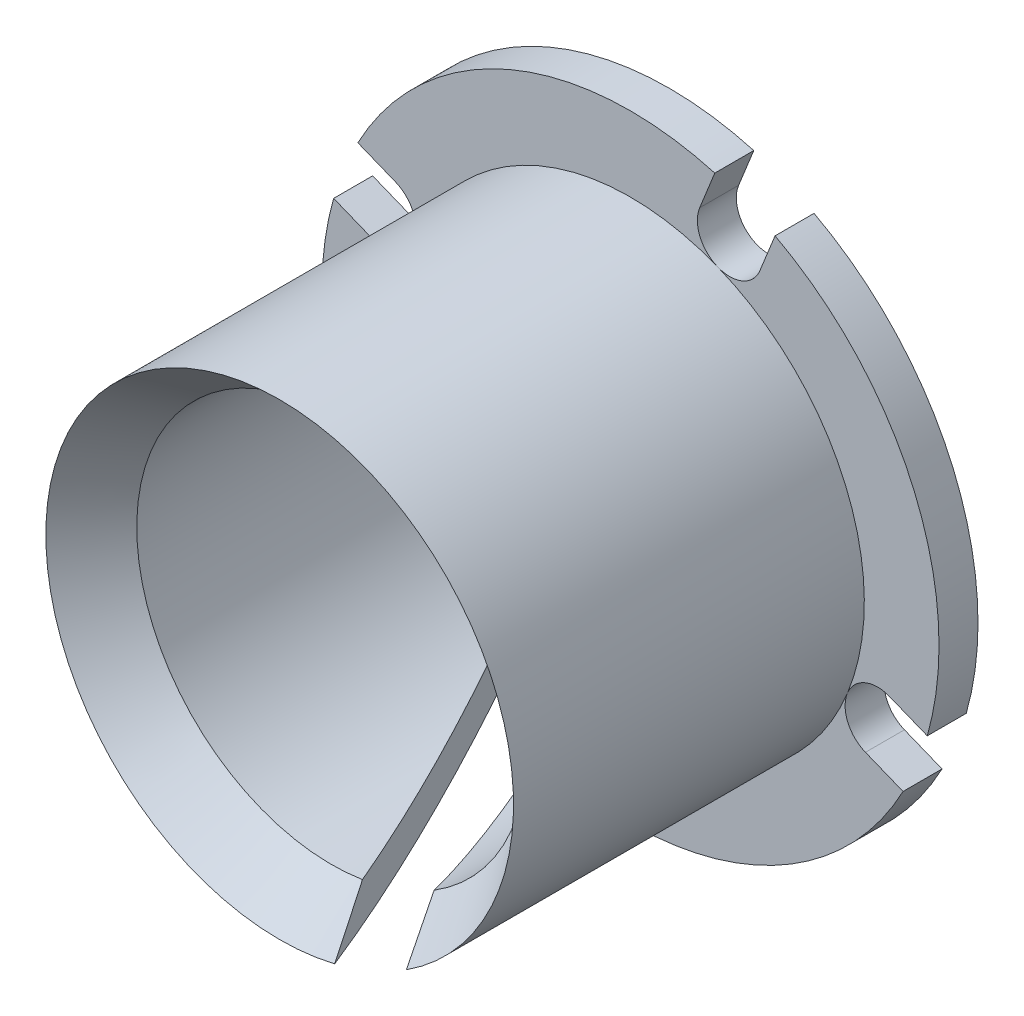
ISO-10303-21;
HEADER;
FILE_DESCRIPTION(('STEP AP214'),'2;1');
FILE_NAME('part.step','',(''),(''),'','','');
FILE_SCHEMA(('AUTOMOTIVE_DESIGN { 1 0 10303 214 1 1 1 1 }'));
ENDSEC;
DATA;
#1=APPLICATION_CONTEXT('core data for automotive mechanical design processes');
#2=APPLICATION_PROTOCOL_DEFINITION('international standard','automotive_design',2000,#1);
#3=PRODUCT_CONTEXT('',#1,'mechanical');
#4=PRODUCT('Part','Part','',(#3));
#5=PRODUCT_RELATED_PRODUCT_CATEGORY('part','',(#4));
#6=PRODUCT_DEFINITION_FORMATION('','',#4);
#7=PRODUCT_DEFINITION_CONTEXT('part definition',#1,'design');
#8=PRODUCT_DEFINITION('design','',#6,#7);
#9=PRODUCT_DEFINITION_SHAPE('','',#8);
#10=(LENGTH_UNIT() NAMED_UNIT(*) SI_UNIT(.MILLI.,.METRE.));
#11=(NAMED_UNIT(*) PLANE_ANGLE_UNIT() SI_UNIT($,.RADIAN.));
#12=(NAMED_UNIT(*) SI_UNIT($,.STERADIAN.) SOLID_ANGLE_UNIT());
#13=UNCERTAINTY_MEASURE_WITH_UNIT(LENGTH_MEASURE(1.E-05),#10,'distance_accuracy_value','');
#14=(GEOMETRIC_REPRESENTATION_CONTEXT(3) GLOBAL_UNCERTAINTY_ASSIGNED_CONTEXT((#13)) GLOBAL_UNIT_ASSIGNED_CONTEXT((#10,
#11,#12)) REPRESENTATION_CONTEXT('',''));
#15=CARTESIAN_POINT('',(0.,0.,0.));
#16=DIRECTION('',(0.,0.,1.));
#17=DIRECTION('',(1.,0.,0.));
#18=AXIS2_PLACEMENT_3D('',#15,#16,#17);
#19=CARTESIAN_POINT('',(-1.57623508961264,-2.09907311503764,0.6));
#20=DIRECTION('',(0.,0.,1.));
#21=DIRECTION('',(1.,0.,0.));
#22=AXIS2_PLACEMENT_3D('',#19,#20,#21);
#23=PLANE('',#22);
#24=CARTESIAN_POINT('',(3.89094409903451E-11,7.33475780112514E-11,0.6));
#25=DIRECTION('',(0.,0.,-1.));
#26=DIRECTION('',(1.,0.,0.));
#27=AXIS2_PLACEMENT_3D('',#24,#25,#26);
#28=CIRCLE('',#27,3.);
#29=CARTESIAN_POINT('',(-0.360597797025849,-2.97824935639324,0.600000000000001));
#30=VERTEX_POINT('',#29);
#31=CARTESIAN_POINT('',(-0.567449420090751,-2.94584472702065,0.6));
#32=VERTEX_POINT('',#31);
#33=EDGE_CURVE('E213',#30,#32,#28,.T.);
#34=ORIENTED_EDGE('',*,*,#33,.F.);
#35=DIRECTION('',(0.120199265684636,0.992749785458992,0.));
#36=VECTOR('',#35,1.);
#37=CARTESIAN_POINT('',(-0.360597797014999,-2.97824935630363,0.6));
#38=LINE('',#37,#36);
#39=CARTESIAN_POINT('',(-0.432717356435095,-3.57389922765595,0.6));
#40=VERTEX_POINT('',#39);
#41=EDGE_CURVE('E334',#40,#30,#38,.T.);
#42=ORIENTED_EDGE('',*,*,#41,.F.);
#43=CARTESIAN_POINT('',(0.,0.,0.6));
#44=DIRECTION('',(0.,0.,1.));
#45=DIRECTION('',(1.,0.,0.));
#46=AXIS2_PLACEMENT_3D('',#43,#44,#45);
#47=CIRCLE('',#46,3.6);
#48=CARTESIAN_POINT('',(-0.56744942009075,-3.5549966463611,0.6));
#49=VERTEX_POINT('',#48);
#50=EDGE_CURVE('E317',#49,#40,#47,.T.);
#51=ORIENTED_EDGE('',*,*,#50,.F.);
#52=DIRECTION('',(0.,1.,0.));
#53=VECTOR('',#52,1.);
#54=CARTESIAN_POINT('',(-0.567449420090751,-2.09907311503764,0.6));
#55=LINE('',#54,#53);
#56=EDGE_CURVE('E219',#32,#49,#55,.F.);
#57=ORIENTED_EDGE('',*,*,#56,.F.);
#58=EDGE_LOOP('',(#34,#42,#51,#57));
#59=FACE_BOUND('',#58,.T.);
#60=ADVANCED_FACE('F43',(#59),#23,.F.);
#61=CARTESIAN_POINT('',(-1.67082733905325,-2.49165326703956,0.6));
#62=VERTEX_POINT('',#61);
#63=CARTESIAN_POINT('',(-1.80141153100389,-2.39894070290262,0.600000000000001));
#64=VERTEX_POINT('',#63);
#65=EDGE_CURVE('E303',#62,#64,#28,.T.);
#66=ORIENTED_EDGE('',*,*,#65,.F.);
#67=DIRECTION('',(0.,1.,0.));
#68=VECTOR('',#67,1.);
#69=CARTESIAN_POINT('',(-1.67082733905324,-1.8,0.600000000000002));
#70=LINE('',#69,#68);
#71=CARTESIAN_POINT('',(-1.67082733905325,-3.18878284037535,0.600000000000001));
#72=VERTEX_POINT('',#71);
#73=EDGE_CURVE('E335',#72,#62,#70,.T.);
#74=ORIENTED_EDGE('',*,*,#73,.F.);
#75=CARTESIAN_POINT('',(0.,0.,0.6));
#76=DIRECTION('',(0.,0.,1.));
#77=DIRECTION('',(1.,0.,0.));
#78=AXIS2_PLACEMENT_3D('',#75,#76,#77);
#79=CIRCLE('',#78,3.6);
#80=CARTESIAN_POINT('',(-2.16169383719339,-2.87872884347243,0.6));
#81=VERTEX_POINT('',#80);
#82=EDGE_CURVE('E328',#81,#72,#79,.T.);
#83=ORIENTED_EDGE('',*,*,#82,.F.);
#84=DIRECTION('',(-0.600470510328625,-0.799646900966721,0.));
#85=VECTOR('',#84,1.);
#86=CARTESIAN_POINT('',(-2.85223492402206,-3.79832277951858,0.6));
#87=LINE('',#86,#85);
#88=EDGE_CURVE('E418',#64,#81,#87,.T.);
#89=ORIENTED_EDGE('',*,*,#88,.F.);
#90=EDGE_LOOP('',(#66,#74,#83,#89));
#91=FACE_BOUND('',#90,.T.);
#92=ADVANCED_FACE('F257',(#91),#23,.F.);
#93=CARTESIAN_POINT('',(1.58994048949753,-1.8,5.22653759134955));
#94=DIRECTION('',(-0.90630778703665,0.,0.4226182617407));
#95=DIRECTION('',(0.4226182617407,0.,0.90630778703665));
#96=AXIS2_PLACEMENT_3D('',#93,#94,#95);
#97=PLANE('',#96);
#98=CARTESIAN_POINT('',(1.95061193395295,-3.02574174097349,6.00000000000442));
#99=CARTESIAN_POINT('',(1.88841727296887,-2.94682796098228,5.86662311911029));
#100=CARTESIAN_POINT('',(1.8262327655277,-2.86786944188103,5.73326801255755));
#101=CARTESIAN_POINT('',(1.70188405668569,-2.70986292412993,5.46660134589275));
#102=CARTESIAN_POINT('',(1.6397198552852,-2.63081492547859,5.33328978578144));
#103=CARTESIAN_POINT('',(1.57756580742796,-2.55172218771569,5.20000000001224));
#104=B_SPLINE_CURVE_WITH_KNOTS('',3,(#98,#99,#100,#101,#102,#103),.UNSPECIFIED.,.F.,.F.,(4,2,4),
(0.,0.500963577850252,1.00192716412446),.UNSPECIFIED.);
#105=CARTESIAN_POINT('',(1.95061193394789,-3.02574174097901,6.00000000000352));
#106=VERTEX_POINT('',#105);
#107=CARTESIAN_POINT('',(1.57756580743147,-2.55172218771946,5.20000000003543));
#108=VERTEX_POINT('',#107);
#109=EDGE_CURVE('E220',#106,#108,#104,.T.);
#110=ORIENTED_EDGE('',*,*,#109,.T.);
#111=CARTESIAN_POINT('',(0.,0.,1.81689920842375));
#112=DIRECTION('',(-0.90630778703665,0.,0.4226182617407));
#113=DIRECTION('',(0.4226182617407,0.,0.90630778703665));
#114=AXIS2_PLACEMENT_3D('',#111,#112,#113);
#115=ELLIPSE('',#114,7.09860474945749,3.);
#116=EDGE_CURVE('E207',#108,#32,#115,.F.);
#117=ORIENTED_EDGE('',*,*,#116,.T.);
#118=ORIENTED_EDGE('',*,*,#56,.T.);
#119=CARTESIAN_POINT('',(0.,0.,1.81689920842375));
#120=DIRECTION('',(-0.90630778703665,0.,0.4226182617407));
#121=DIRECTION('',(0.4226182617407,0.,0.90630778703665));
#122=AXIS2_PLACEMENT_3D('',#119,#120,#121);
#123=ELLIPSE('',#122,8.51832569934899,3.6);
#124=EDGE_CURVE('E231',#106,#49,#123,.F.);
#125=ORIENTED_EDGE('',*,*,#124,.F.);
#126=EDGE_LOOP('',(#110,#117,#118,#125));
#127=FACE_BOUND('',#126,.T.);
#128=ADVANCED_FACE('F229',(#127),#97,.T.);
#129=CARTESIAN_POINT('',(-1.67082733905324,-1.8,0.600000000000002));
#130=DIRECTION('',(0.906307787036648,0.,-0.422618261740703));
#131=DIRECTION('',(-0.422618261740703,0.,-0.906307787036648));
#132=AXIS2_PLACEMENT_3D('',#129,#130,#131);
#133=PLANE('',#132);
#134=CARTESIAN_POINT('',(0.286488104402035,-2.68285445564685,4.79747651411004));
#135=CARTESIAN_POINT('',(0.336580770959158,-2.75851373808357,4.90490058420857));
#136=CARTESIAN_POINT('',(0.386852484449027,-2.83350406392013,5.01270862169347));
#137=CARTESIAN_POINT('',(0.487690802595173,-2.9823593459669,5.22895709281042));
#138=CARTESIAN_POINT('',(0.538257398703318,-3.05622433457663,5.33739750811095));
#139=CARTESIAN_POINT('',(0.639618829733666,-3.20303663328409,5.55476779842828));
#140=CARTESIAN_POINT('',(0.690413635282711,-3.27598405713609,5.66369761045414));
#141=CARTESIAN_POINT('',(0.792196792564427,-3.42112055694541,5.88197229563609));
#142=CARTESIAN_POINT('',(0.84318514587878,-3.49330962668719,5.99131717218411));
#143=CARTESIAN_POINT('',(0.996378765009405,-3.70891428342146,6.31984194858763));
#144=CARTESIAN_POINT('',(1.09882246185626,-3.85138154461204,6.5395331654383));
#145=CARTESIAN_POINT('',(1.25283282266271,-4.0637135050155,6.8698094500179));
#146=CARTESIAN_POINT('',(1.30423048067448,-4.1342672788337,6.98003208332213));
#147=CARTESIAN_POINT('',(1.40712347717803,-4.27497242264103,7.20068682639595));
#148=CARTESIAN_POINT('',(1.45861881478091,-4.3451237962689,7.3111189342593));
#149=CARTESIAN_POINT('',(1.51015594297764,-4.41510317847184,7.42164066234037));
#150=B_SPLINE_CURVE_WITH_KNOTS('',3,(#134,#135,#136,#137,#138,#139,#140,#141,#142,#143,#144,
#145,#146,#147,#148,#149),.UNSPECIFIED.,.F.,.F.,(4,2,2,2,2,2,2,4),(0.,0.421848882340559,
0.843685596211584,1.26546948732284,1.68725683272235,2.53074947763676,2.9525514520657,
3.37434960628119),.UNSPECIFIED.);
#151=CARTESIAN_POINT('',(0.474187888474272,-2.96228726603295,5.20000000003543));
#152=VERTEX_POINT('',#151);
#153=CARTESIAN_POINT('',(0.847234014984004,-3.49888475429196,6.00000000000352));
#154=VERTEX_POINT('',#153);
#155=EDGE_CURVE('E226',#152,#154,#150,.T.);
#156=ORIENTED_EDGE('',*,*,#155,.T.);
#157=CARTESIAN_POINT('',(0.,0.,4.18310079157622));
#158=DIRECTION('',(0.906307787036648,0.,-0.422618261740703));
#159=DIRECTION('',(0.422618261740703,0.,0.906307787036648));
#160=AXIS2_PLACEMENT_3D('',#157,#158,#159);
#161=ELLIPSE('',#160,8.51832569934892,3.6);
#162=EDGE_CURVE('E314',#72,#154,#161,.F.);
#163=ORIENTED_EDGE('',*,*,#162,.F.);
#164=ORIENTED_EDGE('',*,*,#73,.T.);
#165=CARTESIAN_POINT('',(0.,0.,4.18310079157622));
#166=DIRECTION('',(0.906307787036648,0.,-0.422618261740703));
#167=DIRECTION('',(0.422618261740703,0.,0.906307787036648));
#168=AXIS2_PLACEMENT_3D('',#165,#166,#167);
#169=ELLIPSE('',#168,7.09860474948767,3.00000000001278);
#170=EDGE_CURVE('E271',#62,#152,#169,.F.);
#171=ORIENTED_EDGE('',*,*,#170,.T.);
#172=EDGE_LOOP('',(#156,#163,#164,#171));
#173=FACE_BOUND('',#172,.T.);
#174=ADVANCED_FACE('F256',(#173),#133,.T.);
#175=CARTESIAN_POINT('',(0.,0.,3.3));
#176=DIRECTION('',(0.,0.,1.));
#177=DIRECTION('',(1.,0.,0.));
#178=AXIS2_PLACEMENT_3D('',#175,#176,#177);
#179=CYLINDRICAL_SURFACE('',#178,3.6);
#180=CARTESIAN_POINT('',(-3.80402319216679,1.52948538843122,0.6));
#181=DIRECTION('',(0.,0.,1.));
#182=DIRECTION('',(0.925585700512025,-0.378538123585542,0.));
#183=AXIS2_PLACEMENT_3D('',#180,#181,#182);
#184=CIRCLE('',#183,0.499999999914164);
#185=CARTESIAN_POINT('',(-3.34123034192431,1.34021632664447,0.599999999999998));
#186=VERTEX_POINT('',#185);
#187=CARTESIAN_POINT('',(-3.33901953822351,1.34571487446698,0.599999999999998));
#188=VERTEX_POINT('',#187);
#189=EDGE_CURVE('E304',#186,#188,#184,.T.);
#190=ORIENTED_EDGE('',*,*,#189,.F.);
#191=EDGE_CURVE('E527',#186,#81,#79,.T.);
#192=ORIENTED_EDGE('',*,*,#191,.T.);
#193=ORIENTED_EDGE('',*,*,#82,.T.);
#194=ORIENTED_EDGE('',*,*,#162,.T.);
#195=CARTESIAN_POINT('',(0.,0.,6.));
#196=DIRECTION('',(0.,0.,1.));
#197=DIRECTION('',(1.,0.,0.));
#198=AXIS2_PLACEMENT_3D('',#195,#196,#197);
#199=CIRCLE('',#198,3.6);
#200=EDGE_CURVE('E295',#154,#106,#199,.F.);
#201=ORIENTED_EDGE('',*,*,#200,.T.);
#202=ORIENTED_EDGE('',*,*,#124,.T.);
#203=ORIENTED_EDGE('',*,*,#50,.T.);
#204=CARTESIAN_POINT('',(3.33901953822346,-1.34571487446709,0.599999999999998));
#205=VERTEX_POINT('',#204);
#206=EDGE_CURVE('E321',#40,#205,#47,.T.);
#207=ORIENTED_EDGE('',*,*,#206,.T.);
#208=CARTESIAN_POINT('',(3.80402319224621,-1.52948538828517,0.6));
#209=DIRECTION('',(0.,0.,1.));
#210=DIRECTION('',(-0.92558570063704,0.378538123279861,0.));
#211=AXIS2_PLACEMENT_3D('',#208,#209,#210);
#212=CIRCLE('',#211,0.499999999985834);
#213=CARTESIAN_POINT('',(3.3412303419245,-1.34021632664399,0.599999999999998));
#214=VERTEX_POINT('',#213);
#215=EDGE_CURVE('E320',#214,#205,#212,.T.);
#216=ORIENTED_EDGE('',*,*,#215,.F.);
#217=CARTESIAN_POINT('',(0.,0.,0.6));
#218=DIRECTION('',(0.,0.,1.));
#219=DIRECTION('',(1.,0.,0.));
#220=AXIS2_PLACEMENT_3D('',#217,#218,#219);
#221=CIRCLE('',#220,3.6);
#222=CARTESIAN_POINT('',(1.34571487446698,3.33901953822351,0.599999999999998));
#223=VERTEX_POINT('',#222);
#224=EDGE_CURVE('E311',#214,#223,#221,.T.);
#225=ORIENTED_EDGE('',*,*,#224,.T.);
#226=CARTESIAN_POINT('',(1.52948538836416,3.80402319229973,0.6));
#227=DIRECTION('',(0.,0.,1.));
#228=DIRECTION('',(-0.378538123377475,-0.925585700597119,0.));
#229=AXIS2_PLACEMENT_3D('',#226,#227,#228);
#230=CIRCLE('',#229,0.499999999941252);
#231=CARTESIAN_POINT('',(1.34021632664399,3.3412303419245,0.599999999999998));
#232=VERTEX_POINT('',#231);
#233=EDGE_CURVE('E308',#232,#223,#230,.T.);
#234=ORIENTED_EDGE('',*,*,#233,.F.);
#235=CARTESIAN_POINT('',(0.,0.,0.6));
#236=DIRECTION('',(0.,0.,1.));
#237=DIRECTION('',(1.,0.,0.));
#238=AXIS2_PLACEMENT_3D('',#235,#236,#237);
#239=CIRCLE('',#238,3.6);
#240=EDGE_CURVE('E305',#232,#188,#239,.T.);
#241=ORIENTED_EDGE('',*,*,#240,.T.);
#242=EDGE_LOOP('',(#190,#192,#193,#194,#201,#202,#203,#207,#216,#225,#234,#241));
#243=FACE_BOUND('',#242,.T.);
#244=ADVANCED_FACE('F261',(#243),#179,.T.);
#245=CARTESIAN_POINT('',(3.89094409903451E-11,7.33475780112514E-11,0.6));
#246=DIRECTION('',(0.,0.,1.));
#247=DIRECTION('',(1.,0.,0.));
#248=AXIS2_PLACEMENT_3D('',#245,#246,#247);
#249=PLANE('',#248);
#250=ORIENTED_EDGE('',*,*,#191,.F.);
#251=CARTESIAN_POINT('',(-3.80402319216679,1.52948538843122,0.6));
#252=DIRECTION('',(0.,0.,1.));
#253=DIRECTION('',(-1.,0.,0.));
#254=AXIS2_PLACEMENT_3D('',#251,#252,#253);
#255=CIRCLE('',#254,0.499999999914165);
#256=CARTESIAN_POINT('',(-3.99054625540979,1.06557898969047,0.6));
#257=VERTEX_POINT('',#256);
#258=EDGE_CURVE('E432',#257,#186,#255,.T.);
#259=ORIENTED_EDGE('',*,*,#258,.F.);
#260=DIRECTION('',(0.927812797640781,-0.373046126550037,0.));
#261=VECTOR('',#260,1.);
#262=CARTESIAN_POINT('',(-3.99054625540979,1.06557898969047,0.6));
#263=LINE('',#262,#261);
#264=CARTESIAN_POINT('',(-4.56914971374091,1.29821835345839,0.6));
#265=VERTEX_POINT('',#264);
#266=EDGE_CURVE('E417',#265,#257,#263,.T.);
#267=ORIENTED_EDGE('',*,*,#266,.F.);
#268=CARTESIAN_POINT('',(3.89094409903451E-11,7.33475780112514E-11,0.6));
#269=DIRECTION('',(0.,0.,-1.));
#270=DIRECTION('',(1.,0.,0.));
#271=AXIS2_PLACEMENT_3D('',#268,#269,#270);
#272=CIRCLE('',#271,4.75);
#273=CARTESIAN_POINT('',(-2.85223492402206,-3.79832277951858,0.6));
#274=VERTEX_POINT('',#273);
#275=EDGE_CURVE('E409',#274,#265,#272,.T.);
#276=ORIENTED_EDGE('',*,*,#275,.F.);
#277=EDGE_CURVE('E339',#81,#274,#87,.T.);
#278=ORIENTED_EDGE('',*,*,#277,.F.);
#279=EDGE_LOOP('',(#250,#259,#267,#276,#278));
#280=FACE_BOUND('',#279,.T.);
#281=ADVANCED_FACE('F258',(#280),#249,.T.);
#282=ORIENTED_EDGE('',*,*,#240,.F.);
#283=CARTESIAN_POINT('',(1.52948538836416,3.80402319229973,0.6));
#284=DIRECTION('',(0.,0.,1.));
#285=DIRECTION('',(-1.,0.,0.));
#286=AXIS2_PLACEMENT_3D('',#283,#284,#285);
#287=CIRCLE('',#286,0.499999999941252);
#288=CARTESIAN_POINT('',(1.06557898959304,3.99054625553982,0.6));
#289=VERTEX_POINT('',#288);
#290=EDGE_CURVE('E437',#289,#232,#287,.T.);
#291=ORIENTED_EDGE('',*,*,#290,.F.);
#292=DIRECTION('',(-0.373046126524007,-0.927812797651247,0.));
#293=VECTOR('',#292,1.);
#294=CARTESIAN_POINT('',(1.06557898959304,3.99054625553982,0.6));
#295=LINE('',#294,#293);
#296=CARTESIAN_POINT('',(1.29821835334408,4.56914971387586,0.6));
#297=VERTEX_POINT('',#296);
#298=EDGE_CURVE('E438',#297,#289,#295,.T.);
#299=ORIENTED_EDGE('',*,*,#298,.F.);
#300=CARTESIAN_POINT('',(3.89094409903451E-11,7.33475780112514E-11,0.6));
#301=DIRECTION('',(0.,0.,-1.));
#302=DIRECTION('',(1.,0.,0.));
#303=AXIS2_PLACEMENT_3D('',#300,#301,#302);
#304=CIRCLE('',#303,4.75);
#305=CARTESIAN_POINT('',(-4.19610358726709,2.22603115093304,0.6));
#306=VERTEX_POINT('',#305);
#307=EDGE_CURVE('E666',#306,#297,#304,.T.);
#308=ORIENTED_EDGE('',*,*,#307,.F.);
#309=DIRECTION('',(-0.927812797647302,0.37304612653382,0.));
#310=VECTOR('',#309,1.);
#311=CARTESIAN_POINT('',(-4.19610358726709,2.22603115093304,0.6));
#312=LINE('',#311,#310);
#313=CARTESIAN_POINT('',(-3.6175001289319,1.99339178717523,0.6));
#314=VERTEX_POINT('',#313);
#315=EDGE_CURVE('E427',#314,#306,#312,.T.);
#316=ORIENTED_EDGE('',*,*,#315,.F.);
#317=EDGE_CURVE('E420',#188,#314,#255,.T.);
#318=ORIENTED_EDGE('',*,*,#317,.F.);
#319=EDGE_LOOP('',(#282,#291,#299,#308,#316,#318));
#320=FACE_BOUND('',#319,.T.);
#321=ADVANCED_FACE('F662',(#320),#249,.T.);
#322=ORIENTED_EDGE('',*,*,#224,.F.);
#323=CARTESIAN_POINT('',(3.80402319224621,-1.52948538828517,0.6));
#324=DIRECTION('',(0.,0.,1.));
#325=DIRECTION('',(-1.,0.,0.));
#326=AXIS2_PLACEMENT_3D('',#323,#324,#325);
#327=CIRCLE('',#326,0.499999999985834);
#328=CARTESIAN_POINT('',(3.99054625550783,-1.06557898947466,0.6));
#329=VERTEX_POINT('',#328);
#330=EDGE_CURVE('E341',#329,#214,#327,.T.);
#331=ORIENTED_EDGE('',*,*,#330,.F.);
#332=DIRECTION('',(-0.927812797647302,0.37304612653382,0.));
#333=VECTOR('',#332,1.);
#334=CARTESIAN_POINT('',(3.99054625550783,-1.06557898947466,0.6));
#335=LINE('',#334,#333);
#336=CARTESIAN_POINT('',(4.56914971384143,-1.29821835323182,0.6));
#337=VERTEX_POINT('',#336);
#338=EDGE_CURVE('E351',#337,#329,#335,.T.);
#339=ORIENTED_EDGE('',*,*,#338,.F.);
#340=CARTESIAN_POINT('',(3.89094409903451E-11,7.33475780112514E-11,0.6));
#341=DIRECTION('',(0.,0.,-1.));
#342=DIRECTION('',(1.,0.,0.));
#343=AXIS2_PLACEMENT_3D('',#340,#341,#342);
#344=CIRCLE('',#343,4.75);
#345=CARTESIAN_POINT('',(2.2260311508986,4.19610358737935,0.6));
#346=VERTEX_POINT('',#345);
#347=EDGE_CURVE('E444',#346,#337,#344,.T.);
#348=ORIENTED_EDGE('',*,*,#347,.F.);
#349=DIRECTION('',(0.373046126550038,0.927812797640781,0.));
#350=VECTOR('',#349,1.);
#351=CARTESIAN_POINT('',(2.2260311508986,4.19610358737935,0.6));
#352=LINE('',#351,#350);
#353=CARTESIAN_POINT('',(1.99339178713004,3.61750012904663,0.6));
#354=VERTEX_POINT('',#353);
#355=EDGE_CURVE('E442',#354,#346,#352,.T.);
#356=ORIENTED_EDGE('',*,*,#355,.F.);
#357=EDGE_CURVE('E435',#223,#354,#287,.T.);
#358=ORIENTED_EDGE('',*,*,#357,.F.);
#359=EDGE_LOOP('',(#322,#331,#339,#348,#356,#358));
#360=FACE_BOUND('',#359,.T.);
#361=ADVANCED_FACE('F515',(#360),#249,.T.);
#362=ORIENTED_EDGE('',*,*,#206,.F.);
#363=CARTESIAN_POINT('',(-0.570946511963111,-4.71556148085686,0.6));
#364=VERTEX_POINT('',#363);
#365=EDGE_CURVE('E357',#364,#40,#38,.T.);
#366=ORIENTED_EDGE('',*,*,#365,.F.);
#367=CARTESIAN_POINT('',(3.89094409903451E-11,7.33475780112514E-11,0.6));
#368=DIRECTION('',(0.,0.,-1.));
#369=DIRECTION('',(1.,0.,0.));
#370=AXIS2_PLACEMENT_3D('',#367,#368,#369);
#371=CIRCLE('',#370,4.75);
#372=CARTESIAN_POINT('',(4.196103587306,-2.22603115085969,0.6));
#373=VERTEX_POINT('',#372);
#374=EDGE_CURVE('E355',#373,#364,#371,.T.);
#375=ORIENTED_EDGE('',*,*,#374,.F.);
#376=DIRECTION('',(0.927812797640781,-0.373046126550038,0.));
#377=VECTOR('',#376,1.);
#378=CARTESIAN_POINT('',(4.196103587306,-2.22603115085969,0.6));
#379=LINE('',#378,#377);
#380=CARTESIAN_POINT('',(3.61750012897647,-1.99339178709241,0.6));
#381=VERTEX_POINT('',#380);
#382=EDGE_CURVE('E345',#381,#373,#379,.T.);
#383=ORIENTED_EDGE('',*,*,#382,.F.);
#384=EDGE_CURVE('E346',#205,#381,#327,.T.);
#385=ORIENTED_EDGE('',*,*,#384,.F.);
#386=EDGE_LOOP('',(#362,#366,#375,#383,#385));
#387=FACE_BOUND('',#386,.T.);
#388=ADVANCED_FACE('F467',(#387),#249,.T.);
#389=CARTESIAN_POINT('',(-2.85223492402206,-3.79832277951858,0.));
#390=DIRECTION('',(-0.799646900966721,0.600470510328625,0.));
#391=DIRECTION('',(-0.600470510328625,-0.799646900966721,0.));
#392=AXIS2_PLACEMENT_3D('',#389,#390,#391);
#393=PLANE('',#392);
#394=DIRECTION('',(-0.600470510328625,-0.799646900966721,0.));
#395=VECTOR('',#394,1.);
#396=CARTESIAN_POINT('',(-2.85223492402206,-3.79832277951858,0.));
#397=LINE('',#396,#395);
#398=CARTESIAN_POINT('',(-1.97475243638773,-2.62977887966021,0.));
#399=VERTEX_POINT('',#398);
#400=CARTESIAN_POINT('',(-2.85223492402206,-3.79832277951858,0.));
#401=VERTEX_POINT('',#400);
#402=EDGE_CURVE('E360',#399,#401,#397,.T.);
#403=ORIENTED_EDGE('',*,*,#402,.F.);
#404=DIRECTION('',(0.30023525516127,0.399823450479308,0.866025403787365));
#405=VECTOR('',#404,1.);
#406=CARTESIAN_POINT('',(-1.03395904478566E-11,7.76420085578722E-12,5.69615242278992));
#407=LINE('',#406,#405);
#408=CARTESIAN_POINT('',(-1.80141153094697,-2.39894070282682,0.499999999990934));
#409=VERTEX_POINT('',#408);
#410=EDGE_CURVE('E65',#399,#409,#407,.T.);
#411=ORIENTED_EDGE('',*,*,#410,.T.);
#412=DIRECTION('',(0.,0.,1.));
#413=VECTOR('',#412,1.);
#414=CARTESIAN_POINT('',(-1.80141153094697,-2.39894070282682,0.));
#415=LINE('',#414,#413);
#416=EDGE_CURVE('E233',#409,#64,#415,.T.);
#417=ORIENTED_EDGE('',*,*,#416,.T.);
#418=ORIENTED_EDGE('',*,*,#88,.T.);
#419=ORIENTED_EDGE('',*,*,#277,.T.);
#420=DIRECTION('',(0.,0.,1.));
#421=VECTOR('',#420,1.);
#422=CARTESIAN_POINT('',(-2.85223492402206,-3.79832277951858,0.));
#423=LINE('',#422,#421);
#424=EDGE_CURVE('E238',#401,#274,#423,.T.);
#425=ORIENTED_EDGE('',*,*,#424,.F.);
#426=EDGE_LOOP('',(#403,#411,#417,#418,#419,#425));
#427=FACE_BOUND('',#426,.T.);
#428=ADVANCED_FACE('F279',(#427),#393,.F.);
#429=CARTESIAN_POINT('',(3.89094409903451E-11,7.33475780112514E-11,0.));
#430=DIRECTION('',(0.,0.,1.));
#431=DIRECTION('',(1.,0.,0.));
#432=AXIS2_PLACEMENT_3D('',#429,#430,#431);
#433=CYLINDRICAL_SURFACE('',#432,4.75);
#434=ORIENTED_EDGE('',*,*,#275,.T.);
#435=DIRECTION('',(0.,0.,1.));
#436=VECTOR('',#435,1.);
#437=CARTESIAN_POINT('',(-4.56914971374091,1.29821835345839,0.));
#438=LINE('',#437,#436);
#439=CARTESIAN_POINT('',(-4.56914971374091,1.29821835345839,0.));
#440=VERTEX_POINT('',#439);
#441=EDGE_CURVE('E400',#440,#265,#438,.T.);
#442=ORIENTED_EDGE('',*,*,#441,.F.);
#443=CARTESIAN_POINT('',(3.89094409903451E-11,7.33475780112514E-11,0.));
#444=DIRECTION('',(0.,0.,-1.));
#445=DIRECTION('',(1.,0.,0.));
#446=AXIS2_PLACEMENT_3D('',#443,#444,#445);
#447=CIRCLE('',#446,4.75);
#448=EDGE_CURVE('E410',#401,#440,#447,.T.);
#449=ORIENTED_EDGE('',*,*,#448,.F.);
#450=ORIENTED_EDGE('',*,*,#424,.T.);
#451=EDGE_LOOP('',(#434,#442,#449,#450));
#452=FACE_BOUND('',#451,.T.);
#453=ADVANCED_FACE('F407',(#452),#433,.T.);
#454=CARTESIAN_POINT('',(-3.99054625540979,1.06557898969047,0.));
#455=DIRECTION('',(-0.373046126550037,-0.927812797640781,0.));
#456=DIRECTION('',(0.927812797640781,-0.373046126550037,0.));
#457=AXIS2_PLACEMENT_3D('',#454,#455,#456);
#458=PLANE('',#457);
#459=ORIENTED_EDGE('',*,*,#266,.T.);
#460=DIRECTION('',(0.,0.,1.));
#461=VECTOR('',#460,1.);
#462=CARTESIAN_POINT('',(-3.99054625540979,1.06557898969047,0.));
#463=LINE('',#462,#461);
#464=CARTESIAN_POINT('',(-3.99054625540979,1.06557898969047,0.));
#465=VERTEX_POINT('',#464);
#466=EDGE_CURVE('E397',#465,#257,#463,.T.);
#467=ORIENTED_EDGE('',*,*,#466,.F.);
#468=DIRECTION('',(0.927812797640781,-0.373046126550037,0.));
#469=VECTOR('',#468,1.);
#470=CARTESIAN_POINT('',(-3.99054625540979,1.06557898969047,0.));
#471=LINE('',#470,#469);
#472=EDGE_CURVE('E504',#440,#465,#471,.T.);
#473=ORIENTED_EDGE('',*,*,#472,.F.);
#474=ORIENTED_EDGE('',*,*,#441,.T.);
#475=EDGE_LOOP('',(#459,#467,#473,#474));
#476=FACE_BOUND('',#475,.T.);
#477=ADVANCED_FACE('F514',(#476),#458,.F.);
#478=CARTESIAN_POINT('',(-3.80402319216679,1.52948538843122,0.));
#479=DIRECTION('',(0.,0.,1.));
#480=DIRECTION('',(1.,0.,0.));
#481=AXIS2_PLACEMENT_3D('',#478,#479,#480);
#482=CYLINDRICAL_SURFACE('',#481,0.499999999914165);
#483=ORIENTED_EDGE('',*,*,#258,.T.);
#484=ORIENTED_EDGE('',*,*,#189,.T.);
#485=ORIENTED_EDGE('',*,*,#317,.T.);
#486=DIRECTION('',(0.,0.,1.));
#487=VECTOR('',#486,1.);
#488=CARTESIAN_POINT('',(-3.6175001289319,1.99339178717523,0.));
#489=LINE('',#488,#487);
#490=CARTESIAN_POINT('',(-3.6175001289319,1.99339178717523,0.));
#491=VERTEX_POINT('',#490);
#492=EDGE_CURVE('E394',#491,#314,#489,.T.);
#493=ORIENTED_EDGE('',*,*,#492,.F.);
#494=CARTESIAN_POINT('',(-3.80402319216679,1.52948538843122,0.));
#495=DIRECTION('',(0.,0.,1.));
#496=DIRECTION('',(-1.,0.,0.));
#497=AXIS2_PLACEMENT_3D('',#494,#495,#496);
#498=CIRCLE('',#497,0.499999999914165);
#499=EDGE_CURVE('E502',#465,#491,#498,.T.);
#500=ORIENTED_EDGE('',*,*,#499,.F.);
#501=ORIENTED_EDGE('',*,*,#466,.T.);
#502=EDGE_LOOP('',(#483,#484,#485,#493,#500,#501));
#503=FACE_BOUND('',#502,.T.);
#504=ADVANCED_FACE('F633',(#503),#482,.F.);
#505=CARTESIAN_POINT('',(-4.19610358726709,2.22603115093304,0.));
#506=DIRECTION('',(0.37304612653382,0.927812797647302,0.));
#507=DIRECTION('',(-0.927812797647302,0.37304612653382,0.));
#508=AXIS2_PLACEMENT_3D('',#505,#506,#507);
#509=PLANE('',#508);
#510=ORIENTED_EDGE('',*,*,#315,.T.);
#511=DIRECTION('',(0.,0.,1.));
#512=VECTOR('',#511,1.);
#513=CARTESIAN_POINT('',(-4.19610358726709,2.22603115093304,0.));
#514=LINE('',#513,#512);
#515=CARTESIAN_POINT('',(-4.19610358726709,2.22603115093304,0.));
#516=VERTEX_POINT('',#515);
#517=EDGE_CURVE('E391',#516,#306,#514,.T.);
#518=ORIENTED_EDGE('',*,*,#517,.F.);
#519=DIRECTION('',(-0.927812797647302,0.37304612653382,0.));
#520=VECTOR('',#519,1.);
#521=CARTESIAN_POINT('',(-4.19610358726709,2.22603115093304,0.));
#522=LINE('',#521,#520);
#523=EDGE_CURVE('E500',#491,#516,#522,.T.);
#524=ORIENTED_EDGE('',*,*,#523,.F.);
#525=ORIENTED_EDGE('',*,*,#492,.T.);
#526=EDGE_LOOP('',(#510,#518,#524,#525));
#527=FACE_BOUND('',#526,.T.);
#528=ADVANCED_FACE('F681',(#527),#509,.F.);
#529=CARTESIAN_POINT('',(3.89094409903451E-11,7.33475780112514E-11,0.));
#530=DIRECTION('',(0.,0.,1.));
#531=DIRECTION('',(1.,0.,0.));
#532=AXIS2_PLACEMENT_3D('',#529,#530,#531);
#533=CYLINDRICAL_SURFACE('',#532,4.75);
#534=ORIENTED_EDGE('',*,*,#307,.T.);
#535=DIRECTION('',(0.,0.,1.));
#536=VECTOR('',#535,1.);
#537=CARTESIAN_POINT('',(1.29821835334408,4.56914971387586,0.));
#538=LINE('',#537,#536);
#539=CARTESIAN_POINT('',(1.29821835334408,4.56914971387586,0.));
#540=VERTEX_POINT('',#539);
#541=EDGE_CURVE('E388',#540,#297,#538,.T.);
#542=ORIENTED_EDGE('',*,*,#541,.F.);
#543=CARTESIAN_POINT('',(3.89094409903451E-11,7.33475780112514E-11,0.));
#544=DIRECTION('',(0.,0.,-1.));
#545=DIRECTION('',(1.,0.,0.));
#546=AXIS2_PLACEMENT_3D('',#543,#544,#545);
#547=CIRCLE('',#546,4.75);
#548=EDGE_CURVE('E498',#516,#540,#547,.T.);
#549=ORIENTED_EDGE('',*,*,#548,.F.);
#550=ORIENTED_EDGE('',*,*,#517,.T.);
#551=EDGE_LOOP('',(#534,#542,#549,#550));
#552=FACE_BOUND('',#551,.T.);
#553=ADVANCED_FACE('F679',(#552),#533,.T.);
#554=CARTESIAN_POINT('',(1.06557898959304,3.99054625553982,0.));
#555=DIRECTION('',(-0.927812797651247,0.373046126524007,0.));
#556=DIRECTION('',(-0.373046126524007,-0.927812797651247,0.));
#557=AXIS2_PLACEMENT_3D('',#554,#555,#556);
#558=PLANE('',#557);
#559=ORIENTED_EDGE('',*,*,#298,.T.);
#560=DIRECTION('',(0.,0.,1.));
#561=VECTOR('',#560,1.);
#562=CARTESIAN_POINT('',(1.06557898959304,3.99054625553982,0.));
#563=LINE('',#562,#561);
#564=CARTESIAN_POINT('',(1.06557898959304,3.99054625553982,0.));
#565=VERTEX_POINT('',#564);
#566=EDGE_CURVE('E385',#565,#289,#563,.T.);
#567=ORIENTED_EDGE('',*,*,#566,.F.);
#568=DIRECTION('',(-0.373046126524007,-0.927812797651247,0.));
#569=VECTOR('',#568,1.);
#570=CARTESIAN_POINT('',(1.06557898959304,3.99054625553982,0.));
#571=LINE('',#570,#569);
#572=EDGE_CURVE('E496',#540,#565,#571,.T.);
#573=ORIENTED_EDGE('',*,*,#572,.F.);
#574=ORIENTED_EDGE('',*,*,#541,.T.);
#575=EDGE_LOOP('',(#559,#567,#573,#574));
#576=FACE_BOUND('',#575,.T.);
#577=ADVANCED_FACE('F621',(#576),#558,.F.);
#578=CARTESIAN_POINT('',(1.52948538836416,3.80402319229973,0.));
#579=DIRECTION('',(0.,0.,1.));
#580=DIRECTION('',(1.,0.,0.));
#581=AXIS2_PLACEMENT_3D('',#578,#579,#580);
#582=CYLINDRICAL_SURFACE('',#581,0.499999999941252);
#583=ORIENTED_EDGE('',*,*,#290,.T.);
#584=ORIENTED_EDGE('',*,*,#233,.T.);
#585=ORIENTED_EDGE('',*,*,#357,.T.);
#586=DIRECTION('',(0.,0.,1.));
#587=VECTOR('',#586,1.);
#588=CARTESIAN_POINT('',(1.99339178713004,3.61750012904663,0.));
#589=LINE('',#588,#587);
#590=CARTESIAN_POINT('',(1.99339178713004,3.61750012904663,0.));
#591=VERTEX_POINT('',#590);
#592=EDGE_CURVE('E382',#591,#354,#589,.T.);
#593=ORIENTED_EDGE('',*,*,#592,.F.);
#594=CARTESIAN_POINT('',(1.52948538836416,3.80402319229973,0.));
#595=DIRECTION('',(0.,0.,1.));
#596=DIRECTION('',(-1.,0.,0.));
#597=AXIS2_PLACEMENT_3D('',#594,#595,#596);
#598=CIRCLE('',#597,0.499999999941252);
#599=EDGE_CURVE('E494',#565,#591,#598,.T.);
#600=ORIENTED_EDGE('',*,*,#599,.F.);
#601=ORIENTED_EDGE('',*,*,#566,.T.);
#602=EDGE_LOOP('',(#583,#584,#585,#593,#600,#601));
#603=FACE_BOUND('',#602,.T.);
#604=ADVANCED_FACE('F616',(#603),#582,.F.);
#605=CARTESIAN_POINT('',(2.2260311508986,4.19610358737935,0.));
#606=DIRECTION('',(0.927812797640781,-0.373046126550038,0.));
#607=DIRECTION('',(0.373046126550038,0.927812797640781,0.));
#608=AXIS2_PLACEMENT_3D('',#605,#606,#607);
#609=PLANE('',#608);
#610=ORIENTED_EDGE('',*,*,#355,.T.);
#611=DIRECTION('',(0.,0.,1.));
#612=VECTOR('',#611,1.);
#613=CARTESIAN_POINT('',(2.2260311508986,4.19610358737935,0.));
#614=LINE('',#613,#612);
#615=CARTESIAN_POINT('',(2.2260311508986,4.19610358737935,0.));
#616=VERTEX_POINT('',#615);
#617=EDGE_CURVE('E379',#616,#346,#614,.T.);
#618=ORIENTED_EDGE('',*,*,#617,.F.);
#619=DIRECTION('',(0.373046126550038,0.927812797640781,0.));
#620=VECTOR('',#619,1.);
#621=CARTESIAN_POINT('',(2.2260311508986,4.19610358737935,0.));
#622=LINE('',#621,#620);
#623=EDGE_CURVE('E492',#591,#616,#622,.T.);
#624=ORIENTED_EDGE('',*,*,#623,.F.);
#625=ORIENTED_EDGE('',*,*,#592,.T.);
#626=EDGE_LOOP('',(#610,#618,#624,#625));
#627=FACE_BOUND('',#626,.T.);
#628=ADVANCED_FACE('F613',(#627),#609,.F.);
#629=CARTESIAN_POINT('',(3.89094409903451E-11,7.33475780112514E-11,0.));
#630=DIRECTION('',(0.,0.,1.));
#631=DIRECTION('',(1.,0.,0.));
#632=AXIS2_PLACEMENT_3D('',#629,#630,#631);
#633=CYLINDRICAL_SURFACE('',#632,4.75);
#634=ORIENTED_EDGE('',*,*,#347,.T.);
#635=DIRECTION('',(0.,0.,1.));
#636=VECTOR('',#635,1.);
#637=CARTESIAN_POINT('',(4.56914971384143,-1.29821835323182,0.));
#638=LINE('',#637,#636);
#639=CARTESIAN_POINT('',(4.56914971384143,-1.29821835323182,0.));
#640=VERTEX_POINT('',#639);
#641=EDGE_CURVE('E376',#640,#337,#638,.T.);
#642=ORIENTED_EDGE('',*,*,#641,.F.);
#643=CARTESIAN_POINT('',(3.89094409903451E-11,7.33475780112514E-11,0.));
#644=DIRECTION('',(0.,0.,-1.));
#645=DIRECTION('',(1.,0.,0.));
#646=AXIS2_PLACEMENT_3D('',#643,#644,#645);
#647=CIRCLE('',#646,4.75);
#648=EDGE_CURVE('E490',#616,#640,#647,.T.);
#649=ORIENTED_EDGE('',*,*,#648,.F.);
#650=ORIENTED_EDGE('',*,*,#617,.T.);
#651=EDGE_LOOP('',(#634,#642,#649,#650));
#652=FACE_BOUND('',#651,.T.);
#653=ADVANCED_FACE('F610',(#652),#633,.T.);
#654=CARTESIAN_POINT('',(3.99054625550783,-1.06557898947466,0.));
#655=DIRECTION('',(0.37304612653382,0.927812797647302,0.));
#656=DIRECTION('',(-0.927812797647302,0.37304612653382,0.));
#657=AXIS2_PLACEMENT_3D('',#654,#655,#656);
#658=PLANE('',#657);
#659=ORIENTED_EDGE('',*,*,#338,.T.);
#660=DIRECTION('',(0.,0.,1.));
#661=VECTOR('',#660,1.);
#662=CARTESIAN_POINT('',(3.99054625550783,-1.06557898947466,0.));
#663=LINE('',#662,#661);
#664=CARTESIAN_POINT('',(3.99054625550783,-1.06557898947466,0.));
#665=VERTEX_POINT('',#664);
#666=EDGE_CURVE('E373',#665,#329,#663,.T.);
#667=ORIENTED_EDGE('',*,*,#666,.F.);
#668=DIRECTION('',(-0.927812797647302,0.37304612653382,0.));
#669=VECTOR('',#668,1.);
#670=CARTESIAN_POINT('',(3.99054625550783,-1.06557898947466,0.));
#671=LINE('',#670,#669);
#672=EDGE_CURVE('E488',#640,#665,#671,.T.);
#673=ORIENTED_EDGE('',*,*,#672,.F.);
#674=ORIENTED_EDGE('',*,*,#641,.T.);
#675=EDGE_LOOP('',(#659,#667,#673,#674));
#676=FACE_BOUND('',#675,.T.);
#677=ADVANCED_FACE('F606',(#676),#658,.F.);
#678=CARTESIAN_POINT('',(3.80402319224621,-1.52948538828517,0.));
#679=DIRECTION('',(0.,0.,1.));
#680=DIRECTION('',(1.,0.,0.));
#681=AXIS2_PLACEMENT_3D('',#678,#679,#680);
#682=CYLINDRICAL_SURFACE('',#681,0.499999999985834);
#683=ORIENTED_EDGE('',*,*,#330,.T.);
#684=ORIENTED_EDGE('',*,*,#215,.T.);
#685=ORIENTED_EDGE('',*,*,#384,.T.);
#686=DIRECTION('',(0.,0.,1.));
#687=VECTOR('',#686,1.);
#688=CARTESIAN_POINT('',(3.61750012897647,-1.99339178709241,0.));
#689=LINE('',#688,#687);
#690=CARTESIAN_POINT('',(3.61750012897647,-1.99339178709241,0.));
#691=VERTEX_POINT('',#690);
#692=EDGE_CURVE('E370',#691,#381,#689,.T.);
#693=ORIENTED_EDGE('',*,*,#692,.F.);
#694=CARTESIAN_POINT('',(3.80402319224621,-1.52948538828517,0.));
#695=DIRECTION('',(0.,0.,1.));
#696=DIRECTION('',(-1.,0.,0.));
#697=AXIS2_PLACEMENT_3D('',#694,#695,#696);
#698=CIRCLE('',#697,0.499999999985834);
#699=EDGE_CURVE('E486',#665,#691,#698,.T.);
#700=ORIENTED_EDGE('',*,*,#699,.F.);
#701=ORIENTED_EDGE('',*,*,#666,.T.);
#702=EDGE_LOOP('',(#683,#684,#685,#693,#700,#701));
#703=FACE_BOUND('',#702,.T.);
#704=ADVANCED_FACE('F455',(#703),#682,.F.);
#705=CARTESIAN_POINT('',(4.196103587306,-2.22603115085969,0.));
#706=DIRECTION('',(-0.373046126550038,-0.927812797640781,0.));
#707=DIRECTION('',(0.927812797640781,-0.373046126550038,0.));
#708=AXIS2_PLACEMENT_3D('',#705,#706,#707);
#709=PLANE('',#708);
#710=ORIENTED_EDGE('',*,*,#382,.T.);
#711=DIRECTION('',(0.,0.,1.));
#712=VECTOR('',#711,1.);
#713=CARTESIAN_POINT('',(4.196103587306,-2.22603115085969,0.));
#714=LINE('',#713,#712);
#715=CARTESIAN_POINT('',(4.196103587306,-2.22603115085969,0.));
#716=VERTEX_POINT('',#715);
#717=EDGE_CURVE('E367',#716,#373,#714,.T.);
#718=ORIENTED_EDGE('',*,*,#717,.F.);
#719=DIRECTION('',(0.927812797640781,-0.373046126550038,0.));
#720=VECTOR('',#719,1.);
#721=CARTESIAN_POINT('',(4.196103587306,-2.22603115085969,0.));
#722=LINE('',#721,#720);
#723=EDGE_CURVE('E465',#691,#716,#722,.T.);
#724=ORIENTED_EDGE('',*,*,#723,.F.);
#725=ORIENTED_EDGE('',*,*,#692,.T.);
#726=EDGE_LOOP('',(#710,#718,#724,#725));
#727=FACE_BOUND('',#726,.T.);
#728=ADVANCED_FACE('F463',(#727),#709,.F.);
#729=CARTESIAN_POINT('',(3.89094409903451E-11,7.33475780112514E-11,0.));
#730=DIRECTION('',(0.,0.,1.));
#731=DIRECTION('',(1.,0.,0.));
#732=AXIS2_PLACEMENT_3D('',#729,#730,#731);
#733=CYLINDRICAL_SURFACE('',#732,4.75);
#734=ORIENTED_EDGE('',*,*,#374,.T.);
#735=DIRECTION('',(0.,0.,1.));
#736=VECTOR('',#735,1.);
#737=CARTESIAN_POINT('',(-0.570946511963111,-4.71556148085686,0.));
#738=LINE('',#737,#736);
#739=CARTESIAN_POINT('',(-0.570946511963111,-4.71556148085686,0.));
#740=VERTEX_POINT('',#739);
#741=EDGE_CURVE('E363',#740,#364,#738,.T.);
#742=ORIENTED_EDGE('',*,*,#741,.F.);
#743=CARTESIAN_POINT('',(3.89094409903451E-11,7.33475780112514E-11,0.));
#744=DIRECTION('',(0.,0.,-1.));
#745=DIRECTION('',(1.,0.,0.));
#746=AXIS2_PLACEMENT_3D('',#743,#744,#745);
#747=CIRCLE('',#746,4.75);
#748=EDGE_CURVE('E482',#716,#740,#747,.T.);
#749=ORIENTED_EDGE('',*,*,#748,.F.);
#750=ORIENTED_EDGE('',*,*,#717,.T.);
#751=EDGE_LOOP('',(#734,#742,#749,#750));
#752=FACE_BOUND('',#751,.T.);
#753=ADVANCED_FACE('F471',(#752),#733,.T.);
#754=CARTESIAN_POINT('',(-0.360597797014999,-2.97824935630363,0.));
#755=DIRECTION('',(0.992749785458992,-0.120199265684636,0.));
#756=DIRECTION('',(0.120199265684636,0.992749785458992,0.));
#757=AXIS2_PLACEMENT_3D('',#754,#755,#756);
#758=PLANE('',#757);
#759=DIRECTION('',(0.,0.,1.));
#760=VECTOR('',#759,1.);
#761=CARTESIAN_POINT('',(-0.360597797014999,-2.97824935630363,0.));
#762=LINE('',#761,#760);
#763=CARTESIAN_POINT('',(-0.360597797014999,-2.97824935630363,0.500000000147283));
#764=VERTEX_POINT('',#763);
#765=EDGE_CURVE('E361',#764,#30,#762,.T.);
#766=ORIENTED_EDGE('',*,*,#765,.F.);
#767=DIRECTION('',(-0.0600996328417089,-0.496374892724465,-0.866025403787364));
#768=VECTOR('',#767,1.);
#769=CARTESIAN_POINT('',(2.95950851726553E-11,-3.58328710590728E-12,5.69615242278992));
#770=LINE('',#769,#768);
#771=CARTESIAN_POINT('',(-0.395296336224461,-3.26483153432052,0.));
#772=VERTEX_POINT('',#771);
#773=EDGE_CURVE('E13',#764,#772,#770,.T.);
#774=ORIENTED_EDGE('',*,*,#773,.T.);
#775=DIRECTION('',(0.120199265684636,0.992749785458992,0.));
#776=VECTOR('',#775,1.);
#777=CARTESIAN_POINT('',(-0.360597797014999,-2.97824935630363,0.));
#778=LINE('',#777,#776);
#779=EDGE_CURVE('E364',#740,#772,#778,.T.);
#780=ORIENTED_EDGE('',*,*,#779,.F.);
#781=ORIENTED_EDGE('',*,*,#741,.T.);
#782=ORIENTED_EDGE('',*,*,#365,.T.);
#783=ORIENTED_EDGE('',*,*,#41,.T.);
#784=EDGE_LOOP('',(#766,#774,#780,#781,#782,#783));
#785=FACE_BOUND('',#784,.T.);
#786=ADVANCED_FACE('F475',(#785),#758,.F.);
#787=CARTESIAN_POINT('',(3.89094409903451E-11,7.33475780112514E-11,0.));
#788=DIRECTION('',(0.,0.,1.));
#789=DIRECTION('',(1.,0.,0.));
#790=AXIS2_PLACEMENT_3D('',#787,#788,#789);
#791=PLANE('',#790);
#792=ORIENTED_EDGE('',*,*,#779,.T.);
#793=CARTESIAN_POINT('',(0.,0.,0.));
#794=DIRECTION('',(0.,0.,1.));
#795=DIRECTION('',(1.,0.,0.));
#796=AXIS2_PLACEMENT_3D('',#793,#794,#795);
#797=CIRCLE('',#796,3.28867513459846);
#798=EDGE_CURVE('E508',#772,#399,#797,.T.);
#799=ORIENTED_EDGE('',*,*,#798,.T.);
#800=ORIENTED_EDGE('',*,*,#402,.T.);
#801=ORIENTED_EDGE('',*,*,#448,.T.);
#802=ORIENTED_EDGE('',*,*,#472,.T.);
#803=ORIENTED_EDGE('',*,*,#499,.T.);
#804=ORIENTED_EDGE('',*,*,#523,.T.);
#805=ORIENTED_EDGE('',*,*,#548,.T.);
#806=ORIENTED_EDGE('',*,*,#572,.T.);
#807=ORIENTED_EDGE('',*,*,#599,.T.);
#808=ORIENTED_EDGE('',*,*,#623,.T.);
#809=ORIENTED_EDGE('',*,*,#648,.T.);
#810=ORIENTED_EDGE('',*,*,#672,.T.);
#811=ORIENTED_EDGE('',*,*,#699,.T.);
#812=ORIENTED_EDGE('',*,*,#723,.T.);
#813=ORIENTED_EDGE('',*,*,#748,.T.);
#814=EDGE_LOOP('',(#792,#799,#800,#801,#802,#803,#804,#805,#806,#807,#808,#809,#810,#811,#812,#813));
#815=FACE_BOUND('',#814,.T.);
#816=ADVANCED_FACE('F507',(#815),#791,.F.);
#817=CARTESIAN_POINT('',(0.,0.,5.20000000003543));
#818=DIRECTION('',(0.,0.,1.));
#819=DIRECTION('',(1.,0.,0.));
#820=AXIS2_PLACEMENT_3D('',#817,#818,#819);
#821=CONICAL_SURFACE('',#820,3.00000000001278,0.643501108798053);
#822=ORIENTED_EDGE('',*,*,#109,.F.);
#823=ORIENTED_EDGE('',*,*,#200,.F.);
#824=ORIENTED_EDGE('',*,*,#155,.F.);
#825=CARTESIAN_POINT('',(0.,0.,5.20000000003543));
#826=DIRECTION('',(0.,0.,-1.));
#827=DIRECTION('',(-1.,0.,0.));
#828=AXIS2_PLACEMENT_3D('',#825,#826,#827);
#829=CIRCLE('',#828,3.00000000001278);
#830=EDGE_CURVE('E210',#152,#108,#829,.T.);
#831=ORIENTED_EDGE('',*,*,#830,.T.);
#832=EDGE_LOOP('',(#822,#823,#824,#831));
#833=FACE_BOUND('',#832,.T.);
#834=ADVANCED_FACE('F223',(#833),#821,.F.);
#835=CARTESIAN_POINT('',(0.,0.,6.00000000000352));
#836=DIRECTION('',(0.,0.,-1.));
#837=DIRECTION('',(-1.,0.,0.));
#838=AXIS2_PLACEMENT_3D('',#835,#836,#837);
#839=CYLINDRICAL_SURFACE('',#838,3.00000000001278);
#840=ORIENTED_EDGE('',*,*,#416,.F.);
#841=CARTESIAN_POINT('',(0.,0.,0.499999999990934));
#842=DIRECTION('',(0.,0.,1.));
#843=DIRECTION('',(1.,0.,0.));
#844=AXIS2_PLACEMENT_3D('',#841,#842,#843);
#845=CIRCLE('',#844,3.00000000001278);
#846=EDGE_CURVE('E51',#409,#764,#845,.F.);
#847=ORIENTED_EDGE('',*,*,#846,.T.);
#848=ORIENTED_EDGE('',*,*,#765,.T.);
#849=ORIENTED_EDGE('',*,*,#33,.T.);
#850=ORIENTED_EDGE('',*,*,#116,.F.);
#851=ORIENTED_EDGE('',*,*,#830,.F.);
#852=ORIENTED_EDGE('',*,*,#170,.F.);
#853=ORIENTED_EDGE('',*,*,#65,.T.);
#854=EDGE_LOOP('',(#840,#847,#848,#849,#850,#851,#852,#853));
#855=FACE_BOUND('',#854,.T.);
#856=ADVANCED_FACE('F209',(#855),#839,.F.);
#857=CARTESIAN_POINT('',(0.,0.,0.));
#858=DIRECTION('',(0.,0.,-1.));
#859=DIRECTION('',(-1.,0.,0.));
#860=AXIS2_PLACEMENT_3D('',#857,#858,#859);
#861=CONICAL_SURFACE('',#860,3.28867513459846,0.523598775592447);
#862=ORIENTED_EDGE('',*,*,#773,.F.);
#863=ORIENTED_EDGE('',*,*,#846,.F.);
#864=ORIENTED_EDGE('',*,*,#410,.F.);
#865=ORIENTED_EDGE('',*,*,#798,.F.);
#866=EDGE_LOOP('',(#862,#863,#864,#865));
#867=FACE_BOUND('',#866,.T.);
#868=ADVANCED_FACE('F45',(#867),#861,.F.);
#869=CLOSED_SHELL('',(#60,#92,#128,#174,#244,#281,#321,#361,#388,#428,#453,#477,#504,#528,#553,
#577,#604,#628,#653,#677,#704,#728,#753,#786,#816,#834,#856,#868));
#870=MANIFOLD_SOLID_BREP('B2',#869);
#871=ADVANCED_BREP_SHAPE_REPRESENTATION('',(#18,#870),#14);
#872=SHAPE_DEFINITION_REPRESENTATION(#9,#871);
ENDSEC;
END-ISO-10303-21;
